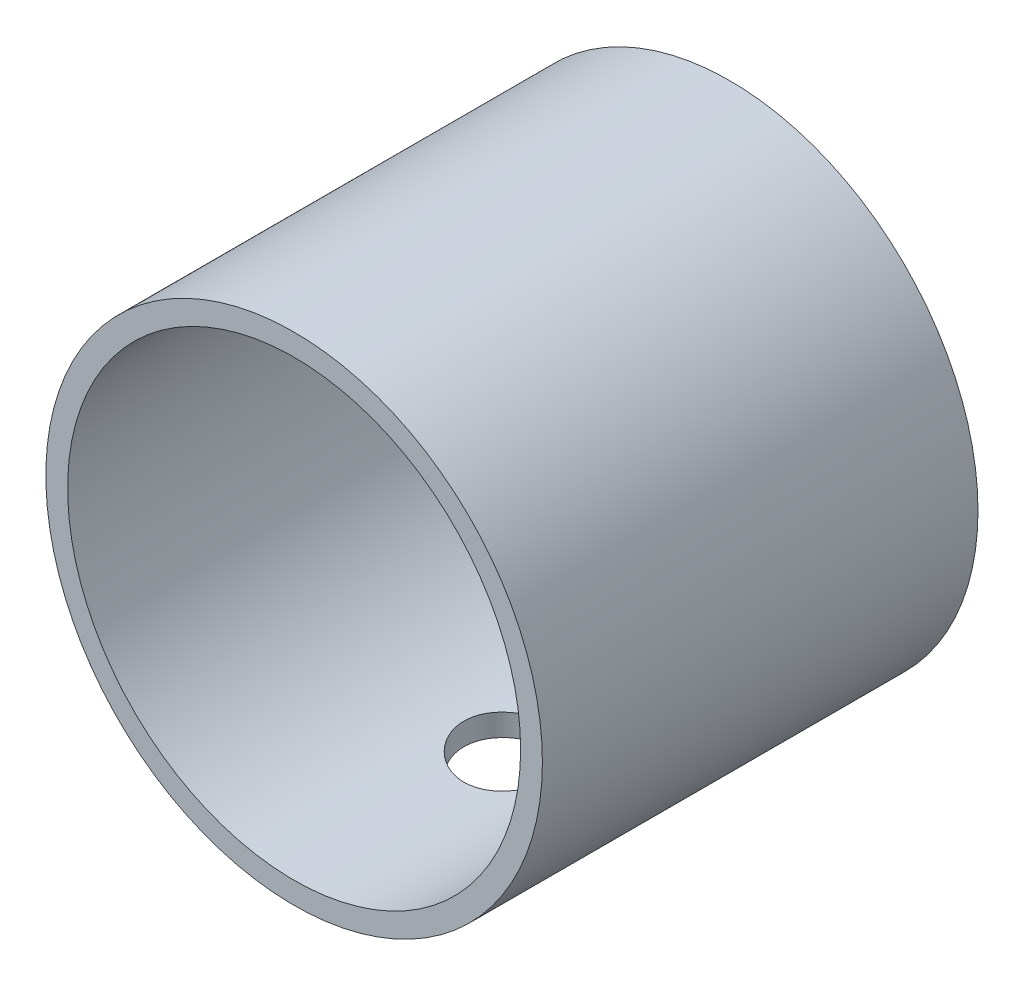
ISO-10303-21;
HEADER;
FILE_DESCRIPTION(('STEP AP214'),'2;1');
FILE_NAME('part.step','',(''),(''),'','','');
FILE_SCHEMA(('AUTOMOTIVE_DESIGN { 1 0 10303 214 1 1 1 1 }'));
ENDSEC;
DATA;
#1=APPLICATION_CONTEXT('core data for automotive mechanical design processes');
#2=APPLICATION_PROTOCOL_DEFINITION('international standard','automotive_design',2000,#1);
#3=PRODUCT_CONTEXT('',#1,'mechanical');
#4=PRODUCT('Part','Part','',(#3));
#5=PRODUCT_RELATED_PRODUCT_CATEGORY('part','',(#4));
#6=PRODUCT_DEFINITION_FORMATION('','',#4);
#7=PRODUCT_DEFINITION_CONTEXT('part definition',#1,'design');
#8=PRODUCT_DEFINITION('design','',#6,#7);
#9=PRODUCT_DEFINITION_SHAPE('','',#8);
#10=(LENGTH_UNIT() NAMED_UNIT(*) SI_UNIT(.MILLI.,.METRE.));
#11=(NAMED_UNIT(*) PLANE_ANGLE_UNIT() SI_UNIT($,.RADIAN.));
#12=(NAMED_UNIT(*) SI_UNIT($,.STERADIAN.) SOLID_ANGLE_UNIT());
#13=UNCERTAINTY_MEASURE_WITH_UNIT(LENGTH_MEASURE(1.E-05),#10,'distance_accuracy_value','');
#14=(GEOMETRIC_REPRESENTATION_CONTEXT(3) GLOBAL_UNCERTAINTY_ASSIGNED_CONTEXT((#13)) GLOBAL_UNIT_ASSIGNED_CONTEXT((#10,
#11,#12)) REPRESENTATION_CONTEXT('',''));
#15=CARTESIAN_POINT('',(0.,0.,0.));
#16=DIRECTION('',(0.,0.,1.));
#17=DIRECTION('',(1.,0.,0.));
#18=AXIS2_PLACEMENT_3D('',#15,#16,#17);
#19=CARTESIAN_POINT('',(0.,0.,50.));
#20=DIRECTION('',(0.,0.,1.));
#21=DIRECTION('',(1.,0.,0.));
#22=AXIS2_PLACEMENT_3D('',#19,#20,#21);
#23=PLANE('',#22);
#24=CARTESIAN_POINT('',(0.,0.,50.));
#25=DIRECTION('',(0.,0.,1.));
#26=DIRECTION('',(1.,0.,0.));
#27=AXIS2_PLACEMENT_3D('',#24,#25,#26);
#28=CIRCLE('',#27,28.5);
#29=CARTESIAN_POINT('',(28.5,0.,50.));
#30=VERTEX_POINT('',#29);
#31=EDGE_CURVE('E10',#30,#30,#28,.T.);
#32=ORIENTED_EDGE('',*,*,#31,.T.);
#33=EDGE_LOOP('',(#32));
#34=FACE_BOUND('',#33,.T.);
#35=CARTESIAN_POINT('',(0.,0.,50.));
#36=DIRECTION('',(0.,0.,1.));
#37=DIRECTION('',(1.,0.,0.));
#38=AXIS2_PLACEMENT_3D('',#35,#36,#37);
#39=CIRCLE('',#38,26.);
#40=CARTESIAN_POINT('',(26.,0.,50.));
#41=VERTEX_POINT('',#40);
#42=EDGE_CURVE('E50',#41,#41,#39,.T.);
#43=ORIENTED_EDGE('',*,*,#42,.F.);
#44=EDGE_LOOP('',(#43));
#45=FACE_BOUND('',#44,.T.);
#46=ADVANCED_FACE('F31',(#34,#45),#23,.T.);
#47=CARTESIAN_POINT('',(0.,0.,0.));
#48=DIRECTION('',(0.,0.,1.));
#49=DIRECTION('',(1.,0.,0.));
#50=AXIS2_PLACEMENT_3D('',#47,#48,#49);
#51=PLANE('',#50);
#52=CARTESIAN_POINT('',(0.,0.,0.));
#53=DIRECTION('',(0.,0.,1.));
#54=DIRECTION('',(1.,0.,0.));
#55=AXIS2_PLACEMENT_3D('',#52,#53,#54);
#56=CIRCLE('',#55,28.5);
#57=CARTESIAN_POINT('',(28.5,0.,0.));
#58=VERTEX_POINT('',#57);
#59=EDGE_CURVE('E45',#58,#58,#56,.T.);
#60=ORIENTED_EDGE('',*,*,#59,.F.);
#61=EDGE_LOOP('',(#60));
#62=FACE_BOUND('',#61,.T.);
#63=CARTESIAN_POINT('',(0.,0.,0.));
#64=DIRECTION('',(0.,0.,1.));
#65=DIRECTION('',(1.,0.,0.));
#66=AXIS2_PLACEMENT_3D('',#63,#64,#65);
#67=CIRCLE('',#66,26.);
#68=CARTESIAN_POINT('',(26.,0.,0.));
#69=VERTEX_POINT('',#68);
#70=EDGE_CURVE('E52',#69,#69,#67,.T.);
#71=ORIENTED_EDGE('',*,*,#70,.T.);
#72=EDGE_LOOP('',(#71));
#73=FACE_BOUND('',#72,.T.);
#74=ADVANCED_FACE('F73',(#62,#73),#51,.F.);
#75=CARTESIAN_POINT('',(0.,0.,50.));
#76=DIRECTION('',(0.,0.,-1.));
#77=DIRECTION('',(-1.,0.,0.));
#78=AXIS2_PLACEMENT_3D('',#75,#76,#77);
#79=CYLINDRICAL_SURFACE('',#78,28.5);
#80=CARTESIAN_POINT('',(0.,-28.5,30.5));
#81=CARTESIAN_POINT('',(0.152999027665979,-28.5000014221919,30.5000028847846));
#82=CARTESIAN_POINT('',(0.305961296387603,-28.4987657957853,30.493614084732));
#83=CARTESIAN_POINT('',(0.610828563499401,-28.493860888237,30.4681146269617));
#84=CARTESIAN_POINT('',(0.762733371734682,-28.4901911802619,30.4490017379837));
#85=CARTESIAN_POINT('',(1.06442565876899,-28.4805161167106,30.3981863718479));
#86=CARTESIAN_POINT('',(1.21421194327397,-28.4745094941689,30.3664770653072));
#87=CARTESIAN_POINT('',(1.51058015613231,-28.4603261340961,30.2907039886646));
#88=CARTESIAN_POINT('',(1.65716088582895,-28.452148599319,30.2466356795059));
#89=CARTESIAN_POINT('',(1.94584324614096,-28.4338634005775,30.1465525350187));
#90=CARTESIAN_POINT('',(2.08795049465545,-28.4237582799862,30.0905534306451));
#91=CARTESIAN_POINT('',(2.36696279019953,-28.4018851183006,29.9669685120469));
#92=CARTESIAN_POINT('',(2.50386589634727,-28.3901164643656,29.8993784257743));
#93=CARTESIAN_POINT('',(2.77142756371521,-28.3652469730652,29.7531486482534));
#94=CARTESIAN_POINT('',(2.90208895397276,-28.3521467478153,29.6745140278222));
#95=CARTESIAN_POINT('',(3.15641107608027,-28.3249613064169,29.5066938115335));
#96=CARTESIAN_POINT('',(3.28006917126932,-28.3108757236952,29.4175042804058));
#97=CARTESIAN_POINT('',(3.52082947379447,-28.2819487280563,29.2281755890311));
#98=CARTESIAN_POINT('',(3.63784488668872,-28.2671007189836,29.1279270491332));
#99=CARTESIAN_POINT('',(3.86308423206199,-28.2372005541132,28.9179453310994));
#100=CARTESIAN_POINT('',(3.97130489133659,-28.2221483247194,28.808208652774));
#101=CARTESIAN_POINT('',(4.17814238627465,-28.1922692396082,28.5800596877543));
#102=CARTESIAN_POINT('',(4.27676201793469,-28.1774423193444,28.4616499445253));
#103=CARTESIAN_POINT('',(4.46378927759803,-28.1484199737008,28.2168800624227));
#104=CARTESIAN_POINT('',(4.55219312578599,-28.1342247832462,28.0905170073842));
#105=CARTESIAN_POINT('',(4.71879594626622,-28.1067634917844,27.8296825789066));
#106=CARTESIAN_POINT('',(4.79690675262082,-28.0935058184955,27.6951539718719));
#107=CARTESIAN_POINT('',(4.94152996771415,-28.0684283562414,27.4198093956019));
#108=CARTESIAN_POINT('',(5.00803802940667,-28.0566091066908,27.2789910946024));
#109=CARTESIAN_POINT('',(5.12889067582267,-28.0347688096959,26.9921535345047));
#110=CARTESIAN_POINT('',(5.1832406316303,-28.0247469686002,26.8461366051816));
#111=CARTESIAN_POINT('',(5.27940674214967,-28.0067888831923,26.5498919523921));
#112=CARTESIAN_POINT('',(5.32121834306304,-27.9988533967508,26.3996627206708));
#113=CARTESIAN_POINT('',(5.42637760720503,-27.9787375043035,25.948104732841));
#114=CARTESIAN_POINT('',(5.47107435145204,-27.9699435242939,25.6420326897452));
#115=CARTESIAN_POINT('',(5.50857417921851,-27.9625811652701,25.02678575995));
#116=CARTESIAN_POINT('',(5.50138219654965,-27.9640118140526,24.7176111710463));
#117=CARTESIAN_POINT('',(5.43588802950817,-27.9768151477162,24.1092989841534));
#118=CARTESIAN_POINT('',(5.37830230452636,-27.9880484596045,23.8100814798011));
#119=CARTESIAN_POINT('',(5.21476609769148,-28.018977010303,23.2256476437351));
#120=CARTESIAN_POINT('',(5.10881345050769,-28.0386726279584,22.9404319394988));
#121=CARTESIAN_POINT('',(4.85086223336583,-28.0844497001242,22.3900002043527));
#122=CARTESIAN_POINT('',(4.69857658625098,-28.1105707674668,22.124922121425));
#123=CARTESIAN_POINT('',(4.35248370318823,-28.1662300270738,21.623813395137));
#124=CARTESIAN_POINT('',(4.15867201215163,-28.1957685858245,21.3877858727241));
#125=CARTESIAN_POINT('',(3.73117659713676,-28.2555405057521,20.9473387598728));
#126=CARTESIAN_POINT('',(3.49688044974372,-28.2857772267584,20.7435135721283));
#127=CARTESIAN_POINT('',(2.99711002060326,-28.3430854476543,20.3779680959047));
#128=CARTESIAN_POINT('',(2.7316353900868,-28.3701569121298,20.2162482784902));
#129=CARTESIAN_POINT('',(2.17640650305288,-28.4181440367153,19.9394069024372));
#130=CARTESIAN_POINT('',(1.88661932252079,-28.4390511704482,19.8243498049431));
#131=CARTESIAN_POINT('',(1.29133665829096,-28.4722886118963,19.6447150138991));
#132=CARTESIAN_POINT('',(0.985842948127889,-28.484619885698,19.5801316342907));
#133=CARTESIAN_POINT('',(0.372930397877595,-28.4991827109023,19.5041110223372));
#134=CARTESIAN_POINT('',(0.0656160786975817,-28.5015689390444,19.4918597849589));
#135=CARTESIAN_POINT('',(-0.546669211732907,-28.4964010939677,19.5186639816571));
#136=CARTESIAN_POINT('',(-0.851640304409078,-28.4888475393695,19.5577167388836));
#137=CARTESIAN_POINT('',(-1.44798119759097,-28.4647453761076,19.6853437735188));
#138=CARTESIAN_POINT('',(-1.73944299168122,-28.4482720667841,19.7735036717203));
#139=CARTESIAN_POINT('',(-2.30344828684298,-28.4081702255106,19.9963922177382));
#140=CARTESIAN_POINT('',(-2.5759904433322,-28.3845411856553,20.1311241712807));
#141=CARTESIAN_POINT('',(-3.09787633753002,-28.3323632313317,20.4451160723121));
#142=CARTESIAN_POINT('',(-3.34691726316845,-28.3037608652429,20.624870254526));
#143=CARTESIAN_POINT('',(-3.81159218432684,-28.2449415295857,21.0231394142316));
#144=CARTESIAN_POINT('',(-4.02722285798005,-28.2147243998681,21.2416582413318));
#145=CARTESIAN_POINT('',(-4.4220707238848,-28.155564303968,21.7149436852578));
#146=CARTESIAN_POINT('',(-4.60073096046742,-28.1266453437901,21.9701784165775));
#147=CARTESIAN_POINT('',(-4.91264185678548,-28.0738505412016,22.5075269840082));
#148=CARTESIAN_POINT('',(-5.04589426317057,-28.0499745048243,22.7896397856978));
#149=CARTESIAN_POINT('',(-5.26243466695746,-28.0101570893528,23.3713034805248));
#150=CARTESIAN_POINT('',(-5.345971748418,-27.9941762234929,23.6707590490898));
#151=CARTESIAN_POINT('',(-5.4614553141596,-27.9718806346853,24.2799678289475));
#152=CARTESIAN_POINT('',(-5.49340800668772,-27.9655647485497,24.5897197964752));
#153=CARTESIAN_POINT('',(-5.5018774906115,-27.9638909980807,25.052147508132));
#154=CARTESIAN_POINT('',(-5.49830742485885,-27.9645968468692,25.2046989838849));
#155=CARTESIAN_POINT('',(-5.47851955607518,-27.9684816434454,25.5089321983806));
#156=CARTESIAN_POINT('',(-5.4623065415704,-27.9716596548985,25.6606142445145));
#157=CARTESIAN_POINT('',(-5.41734680639159,-27.9804014621201,25.9620819811988));
#158=CARTESIAN_POINT('',(-5.38859567870312,-27.9859660967501,26.1118669858926));
#159=CARTESIAN_POINT('',(-5.31879946697563,-27.9993149081431,26.408388794817));
#160=CARTESIAN_POINT('',(-5.27775877722443,-28.0070982915168,26.5551266685668));
#161=CARTESIAN_POINT('',(-5.18377561494467,-28.0246453738365,26.8443289094589));
#162=CARTESIAN_POINT('',(-5.13085423817984,-28.0344055597342,26.986800350142));
#163=CARTESIAN_POINT('',(-5.01348260198808,-28.0556330396245,27.2667193778126));
#164=CARTESIAN_POINT('',(-4.94903643262596,-28.0670997277505,27.4041687263302));
#165=CARTESIAN_POINT('',(-4.80903742968029,-28.0914258459167,27.673231642169));
#166=CARTESIAN_POINT('',(-4.73348004188552,-28.1042858464693,27.8048427876269));
#167=CARTESIAN_POINT('',(-4.57183531516177,-28.1310331809019,28.0612552432783));
#168=CARTESIAN_POINT('',(-4.48575160972347,-28.1449201596376,28.1860588819071));
#169=CARTESIAN_POINT('',(-4.30214085577146,-28.1735754536874,28.4300541786235));
#170=CARTESIAN_POINT('',(-4.20445087509209,-28.1883544092221,28.5491220108751));
#171=CARTESIAN_POINT('',(-3.99948857440641,-28.2181645182373,28.7785909687343));
#172=CARTESIAN_POINT('',(-3.89221964550034,-28.2331955809493,28.8889951356168));
#173=CARTESIAN_POINT('',(-3.66872983020097,-28.2631055637154,29.1005006578453));
#174=CARTESIAN_POINT('',(-3.55250367444284,-28.2779843882907,29.2015964593239));
#175=CARTESIAN_POINT('',(-3.31198337485695,-28.307162227715,29.393682335048));
#176=CARTESIAN_POINT('',(-3.18769221838913,-28.3214614541004,29.4846761177098));
#177=CARTESIAN_POINT('',(-2.93055657030203,-28.3492279129138,29.6568245312855));
#178=CARTESIAN_POINT('',(-2.79763881518953,-28.3626853661096,29.7378713650553));
#179=CARTESIAN_POINT('',(-2.52536171512821,-28.3882235724951,29.8884293447911));
#180=CARTESIAN_POINT('',(-2.38600476702075,-28.4003048322301,29.9579447395429));
#181=CARTESIAN_POINT('',(-2.10186526354853,-28.4227452683883,30.0849145448348));
#182=CARTESIAN_POINT('',(-1.95708616718364,-28.4331055205271,30.1423764953268));
#183=CARTESIAN_POINT('',(-1.66310751202432,-28.4518151326428,30.2448366882404));
#184=CARTESIAN_POINT('',(-1.51390883335696,-28.4601648900113,30.2898373939997));
#185=CARTESIAN_POINT('',(-1.14079027434396,-28.4780260954567,30.3852717292222));
#186=CARTESIAN_POINT('',(-0.914852425300794,-28.4862245147996,30.4282378976399));
#187=CARTESIAN_POINT('',(-0.459248724737565,-28.4972103240361,30.4855994673627));
#188=CARTESIAN_POINT('',(-0.22958297812117,-28.4999978659273,30.499995671231));
#189=CARTESIAN_POINT('',(0.,-28.5,30.5));
#190=B_SPLINE_CURVE_WITH_KNOTS('',3,(#80,#81,#82,#83,#84,#85,#86,#87,#88,#89,#90,#91,#92,#93,
#94,#95,#96,#97,#98,#99,#100,#101,#102,#103,#104,#105,#106,#107,#108,#109,#110,#111,#112,#113,
#114,#115,#116,#117,#118,#119,#120,#121,#122,#123,#124,#125,#126,#127,#128,#129,#130,#131,#132,
#133,#134,#135,#136,#137,#138,#139,#140,#141,#142,#143,#144,#145,#146,#147,#148,#149,#150,#151,
#152,#153,#154,#155,#156,#157,#158,#159,#160,#161,#162,#163,#164,#165,#166,#167,#168,#169,#170,
#171,#172,#173,#174,#175,#176,#177,#178,#179,#180,#181,#182,#183,#184,#185,#186,#187,#188,#189),
.UNSPECIFIED.,.T.,.F.,(4,2,2,2,2,2,2,2,2,2,2,2,2,2,2,2,2,2,2,2,2,2,2,2,2,2,2,2,2,2,2,2,2,2,2,2,
2,2,2,2,2,2,2,2,2,2,2,2,2,2,2,2,2,2,4),(0.,0.458795571821759,0.917671617943335,1.37679679257931,
1.83609081017308,2.29478294774098,2.75364450865476,3.21229607946212,3.6711191948915,
4.13497536355983,4.59900338562003,5.06289586736369,5.52695944234277,5.99477021646012,
6.46275588437195,6.93053440026092,7.39848260318771,8.32191059028985,9.24525077489621,
10.1556730694625,11.0661361265715,11.9823593980407,12.8986810150603,13.8303220122583,
14.7619734319808,15.694907511931,16.6277364781126,17.5460015969987,18.4642188061581,
19.3748027286701,20.2854512985201,21.2065719113845,22.1277840494234,23.0619994996104,
23.996179010372,24.9256378006248,25.854984720984,26.3123227210671,26.7694875881249,
27.2268132734863,27.683975631147,28.1403325671859,28.5965278657338,29.0529106712194,
29.5091363841393,29.9727604309253,30.4362209932125,30.899956312778,31.3635208298414,
31.83173316606,32.2997726033063,32.7675183826897,33.2351716320205,33.9236375284847,
34.6120840848746),.UNSPECIFIED.);
#191=CARTESIAN_POINT('',(0.,-28.5,30.5));
#192=VERTEX_POINT('',#191);
#193=EDGE_CURVE('E55',#192,#192,#190,.T.);
#194=ORIENTED_EDGE('',*,*,#193,.T.);
#195=EDGE_LOOP('',(#194));
#196=FACE_BOUND('',#195,.T.);
#197=ORIENTED_EDGE('',*,*,#31,.F.);
#198=EDGE_LOOP('',(#197));
#199=FACE_BOUND('',#198,.T.);
#200=ORIENTED_EDGE('',*,*,#59,.T.);
#201=EDGE_LOOP('',(#200));
#202=FACE_BOUND('',#201,.T.);
#203=ADVANCED_FACE('F33',(#196,#199,#202),#79,.T.);
#204=CARTESIAN_POINT('',(0.,0.,50.));
#205=DIRECTION('',(0.,0.,-1.));
#206=DIRECTION('',(-1.,0.,0.));
#207=AXIS2_PLACEMENT_3D('',#204,#205,#206);
#208=CYLINDRICAL_SURFACE('',#207,26.);
#209=CARTESIAN_POINT('',(0.,-26.,30.5));
#210=CARTESIAN_POINT('',(0.152696710266405,-26.0000017732406,30.500003334937));
#211=CARTESIAN_POINT('',(0.305352858365942,-25.9986525684042,30.4936395113002));
#212=CARTESIAN_POINT('',(0.609605841063573,-25.9932972947195,30.468242196421));
#213=CARTESIAN_POINT('',(0.761202505206505,-25.9892908078648,30.449206711849));
#214=CARTESIAN_POINT('',(1.06226606972406,-25.978727842005,30.3986023926368));
#215=CARTESIAN_POINT('',(1.2117319285527,-25.9721701574687,30.3670276325979));
#216=CARTESIAN_POINT('',(1.50746102526121,-25.9566849202455,30.2915834252245));
#217=CARTESIAN_POINT('',(1.65372306396901,-25.9477564960738,30.2477094563641));
#218=CARTESIAN_POINT('',(1.94176298250361,-25.9277915021968,30.1480820061399));
#219=CARTESIAN_POINT('',(2.08354684259946,-25.9167578956999,30.0923452100422));
#220=CARTESIAN_POINT('',(2.36192878050332,-25.8928719667996,29.9693517883639));
#221=CARTESIAN_POINT('',(2.49852492276609,-25.8800189738732,29.9020909137273));
#222=CARTESIAN_POINT('',(2.76550452936401,-25.8528525289883,29.756583629454));
#223=CARTESIAN_POINT('',(2.89589062925206,-25.8385397048347,29.6783419367536));
#224=CARTESIAN_POINT('',(3.14970247504028,-25.8088300638434,29.5113699205899));
#225=CARTESIAN_POINT('',(3.27312559302713,-25.7934328426056,29.4226356757129));
#226=CARTESIAN_POINT('',(3.51372670509881,-25.7617670741337,29.2340750075208));
#227=CARTESIAN_POINT('',(3.63080137125803,-25.7454897382787,29.1341181936775));
#228=CARTESIAN_POINT('',(3.85618848318602,-25.7126970051813,28.924726818048));
#229=CARTESIAN_POINT('',(3.96449766493982,-25.6961815219321,28.8152887568392));
#230=CARTESIAN_POINT('',(4.17154955603227,-25.6633817127818,28.5877333031174));
#231=CARTESIAN_POINT('',(4.270294951355,-25.6470973230812,28.469618363984));
#232=CARTESIAN_POINT('',(4.45761415263849,-25.6152046412009,28.2254247782207));
#233=CARTESIAN_POINT('',(4.54618419313998,-25.599596600631,28.0993432100668));
#234=CARTESIAN_POINT('',(4.71331706101922,-25.5693552872972,27.8388079180519));
#235=CARTESIAN_POINT('',(4.7917717463403,-25.5547332370458,27.7042834724986));
#236=CARTESIAN_POINT('',(4.93707869831844,-25.527058714969,27.4288899155799));
#237=CARTESIAN_POINT('',(5.00392660482063,-25.5140068335498,27.288018444838));
#238=CARTESIAN_POINT('',(5.12544528166287,-25.4898736592522,27.0010170183099));
#239=CARTESIAN_POINT('',(5.18012162020181,-25.4787914657587,26.8548895027243));
#240=CARTESIAN_POINT('',(5.27691827138478,-25.4589186975852,26.5583665289638));
#241=CARTESIAN_POINT('',(5.31903404072909,-25.4501289522533,26.4079695479654));
#242=CARTESIAN_POINT('',(5.42488099516896,-25.427860472795,25.9565535892917));
#243=CARTESIAN_POINT('',(5.47003508995308,-25.4180866792856,25.6507456695171));
#244=CARTESIAN_POINT('',(5.50851174579967,-25.4097748671277,25.0359197123241));
#245=CARTESIAN_POINT('',(5.50184025288988,-25.4112355595296,24.7269020472273));
#246=CARTESIAN_POINT('',(5.43753143134929,-25.425071827777,24.1197654831049));
#247=CARTESIAN_POINT('',(5.38076099264253,-25.4372617406008,23.8215506225759));
#248=CARTESIAN_POINT('',(5.21921846090793,-25.4708951279244,23.2389875919585));
#249=CARTESIAN_POINT('',(5.1144438316849,-25.4923390913381,22.9546401554031));
#250=CARTESIAN_POINT('',(4.85906337702358,-25.5422487251904,22.4054073541849));
#251=CARTESIAN_POINT('',(4.70812009675813,-25.5707657938402,22.1406837429281));
#252=CARTESIAN_POINT('',(4.36492333573268,-25.6315767589559,21.6400009507845));
#253=CARTESIAN_POINT('',(4.17266457005307,-25.6638711383599,21.4040454558635));
#254=CARTESIAN_POINT('',(3.74768376037394,-25.729397842583,20.9625988445773));
#255=CARTESIAN_POINT('',(3.51422325901309,-25.7626359415598,20.757818835595));
#256=CARTESIAN_POINT('',(3.01590351317701,-25.8257100714785,20.3902071281144));
#257=CARTESIAN_POINT('',(2.75104376907516,-25.8555460482709,20.2273760972416));
#258=CARTESIAN_POINT('',(2.19660678414072,-25.9085414440315,19.9481262422664));
#259=CARTESIAN_POINT('',(1.90698367822908,-25.9316881104978,19.831795907502));
#260=CARTESIAN_POINT('',(1.31170388765016,-25.9686013915664,19.6496466647123));
#261=CARTESIAN_POINT('',(1.00604938666216,-25.9823692801221,19.5838208963161));
#262=CARTESIAN_POINT('',(0.393487281616225,-25.9987939455803,19.5055727727673));
#263=CARTESIAN_POINT('',(0.0867091127320476,-26.0016529475372,19.4921783415133));
#264=CARTESIAN_POINT('',(-0.524701312239867,-25.9965024316175,19.5165449885749));
#265=CARTESIAN_POINT('',(-0.829333702777753,-25.9884936008974,19.5543028326095));
#266=CARTESIAN_POINT('',(-1.42461776962068,-25.9626344959745,19.679095474202));
#267=CARTESIAN_POINT('',(-1.71538019139245,-25.9448852268135,19.7656247735983));
#268=CARTESIAN_POINT('',(-2.27826612153071,-25.9015301666823,19.9849465042456));
#269=CARTESIAN_POINT('',(-2.5503881123878,-25.8759237369918,20.117742696721));
#270=CARTESIAN_POINT('',(-3.0723198456199,-25.8191937279616,20.4278841426261));
#271=CARTESIAN_POINT('',(-3.32177918193363,-25.7880003995425,20.6058060488581));
#272=CARTESIAN_POINT('',(-3.78764933922966,-25.723707261441,21.0003851549466));
#273=CARTESIAN_POINT('',(-4.00405615855405,-25.6906072215808,21.217047038158));
#274=CARTESIAN_POINT('',(-4.40148601389684,-25.6255391239078,21.6873988677236));
#275=CARTESIAN_POINT('',(-4.58183813404755,-25.5936002380365,21.9416604201667));
#276=CARTESIAN_POINT('',(-4.89727937104976,-25.5351229163127,22.4774497468613));
#277=CARTESIAN_POINT('',(-5.0323703974928,-25.5085842526402,22.7589763701374));
#278=CARTESIAN_POINT('',(-5.25257850755859,-25.4641518490825,23.3397637756661));
#279=CARTESIAN_POINT('',(-5.33796906184382,-25.4462108997104,23.6389173426543));
#280=CARTESIAN_POINT('',(-5.45714877663195,-25.4209241759895,24.2479260359901));
#281=CARTESIAN_POINT('',(-5.4909455801155,-25.4135768323371,24.5577795703131));
#282=CARTESIAN_POINT('',(-5.50207726036747,-25.4111590979774,25.020053281102));
#283=CARTESIAN_POINT('',(-5.49940940735532,-25.4117401939873,25.1722275005447));
#284=CARTESIAN_POINT('',(-5.48148686589421,-25.4156138293037,25.4757825845919));
#285=CARTESIAN_POINT('',(-5.46623697436317,-25.4189053352619,25.6271637294256));
#286=CARTESIAN_POINT('',(-5.42325977145089,-25.4281089390728,25.9281049404537));
#287=CARTESIAN_POINT('',(-5.39552812977035,-25.4340219463934,26.0776643561243));
#288=CARTESIAN_POINT('',(-5.32782306458597,-25.4482906893854,26.3738125799993));
#289=CARTESIAN_POINT('',(-5.28785399520677,-25.4566455561857,26.5204024250416));
#290=CARTESIAN_POINT('',(-5.19610514737913,-25.4755309212674,26.8092523400913));
#291=CARTESIAN_POINT('',(-5.14435764555786,-25.4860554666475,26.9515230601835));
#292=CARTESIAN_POINT('',(-5.02940027750039,-25.5089898782409,27.2311375435225));
#293=CARTESIAN_POINT('',(-4.96619444860524,-25.5213990801464,27.3684830218253));
#294=CARTESIAN_POINT('',(-4.82873591384333,-25.5477632323224,27.6374473811426));
#295=CARTESIAN_POINT('',(-4.75447853410013,-25.5617188359497,27.7690638086636));
#296=CARTESIAN_POINT('',(-4.5954832797184,-25.5907807518929,28.0256073711579));
#297=CARTESIAN_POINT('',(-4.51074896796755,-25.6058866723532,28.1505367595948));
#298=CARTESIAN_POINT('',(-4.32961736185796,-25.6371414010465,28.3952963898356));
#299=CARTESIAN_POINT('',(-4.23302635002306,-25.6533047203179,28.5149814648211));
#300=CARTESIAN_POINT('',(-4.03022535745781,-25.6859460652507,28.745780975946));
#301=CARTESIAN_POINT('',(-3.92401874481836,-25.7024239791344,28.8568983880523));
#302=CARTESIAN_POINT('',(-3.70260429627343,-25.7352530775833,29.0699308012779));
#303=CARTESIAN_POINT('',(-3.58739117670854,-25.7516041814792,29.1718403238754));
#304=CARTESIAN_POINT('',(-3.34883055686276,-25.7837121372106,29.3656550972449));
#305=CARTESIAN_POINT('',(-3.22548606032741,-25.7994692051404,29.4575640093739));
#306=CARTESIAN_POINT('',(-2.96987197557149,-25.830149631287,29.6318552452605));
#307=CARTESIAN_POINT('',(-2.83751084929416,-25.8450602636535,29.7141056444953));
#308=CARTESIAN_POINT('',(-2.5662179291805,-25.8734056386916,29.8671111514398));
#309=CARTESIAN_POINT('',(-2.42728858042962,-25.8868409244826,29.9378704939768));
#310=CARTESIAN_POINT('',(-2.14385926300467,-25.9118521819642,30.0673585093705));
#311=CARTESIAN_POINT('',(-1.99936252045853,-25.923429210945,30.1260940286843));
#312=CARTESIAN_POINT('',(-1.70580907228086,-25.9443999653389,30.2311113600207));
#313=CARTESIAN_POINT('',(-1.55675321132545,-25.9537940924425,30.2773954635602));
#314=CARTESIAN_POINT('',(-1.17708147521322,-25.9743500734289,30.3777729549006));
#315=CARTESIAN_POINT('',(-0.944122542523652,-25.9839168143207,30.4235421836533));
#316=CARTESIAN_POINT('',(-0.474076396856678,-25.9967402782096,30.4846525234859));
#317=CARTESIAN_POINT('',(-0.236989345631298,-25.9999972478836,30.4999948240893));
#318=CARTESIAN_POINT('',(0.,-26.,30.5));
#319=B_SPLINE_CURVE_WITH_KNOTS('',3,(#209,#210,#211,#212,#213,#214,#215,#216,#217,#218,#219,
#220,#221,#222,#223,#224,#225,#226,#227,#228,#229,#230,#231,#232,#233,#234,#235,#236,#237,#238,
#239,#240,#241,#242,#243,#244,#245,#246,#247,#248,#249,#250,#251,#252,#253,#254,#255,#256,#257,
#258,#259,#260,#261,#262,#263,#264,#265,#266,#267,#268,#269,#270,#271,#272,#273,#274,#275,#276,
#277,#278,#279,#280,#281,#282,#283,#284,#285,#286,#287,#288,#289,#290,#291,#292,#293,#294,#295,
#296,#297,#298,#299,#300,#301,#302,#303,#304,#305,#306,#307,#308,#309,#310,#311,#312,#313,#314,
#315,#316,#317,#318),.UNSPECIFIED.,.T.,.F.,(4,2,2,2,2,2,2,2,2,2,2,2,2,2,2,2,2,2,2,2,2,2,2,2,2,2,
2,2,2,2,2,2,2,2,2,2,2,2,2,2,2,2,2,2,2,2,2,2,2,2,2,2,2,2,4),(0.,0.457881882816474,
0.915835810273162,1.37400640053574,1.83234564823854,2.29004444470314,2.74791236441124,
3.20558420030161,3.6634276271444,4.12728503257533,4.5913143779765,5.05521302077706,
5.51928278319777,5.98796221725755,6.45681733437122,6.9254575187616,7.39426701058073,
8.31717599583767,9.23997909592056,10.1471208136108,11.0543104636536,11.9682961331644,
12.8823987859091,13.814953687777,14.7475234305066,15.6818594703437,16.6160685706244,
17.53287304153,18.4496195469831,19.3570345651474,20.2645233679964,21.1842509215126,
22.1040897380403,23.039713112898,23.9752970082961,24.9056830779056,25.8359313088642,
26.2920812108326,26.7480572853985,27.2041916740332,27.6601639565006,28.114901461353,
28.5694790497878,29.0242494355014,29.4788655907376,29.942265839726,30.4055043952346,
30.8690167786127,31.3323588888427,31.801433208777,32.2703342653656,32.7389675788542,
33.2075145875388,33.9181872019296,34.6288320324291),.UNSPECIFIED.);
#320=CARTESIAN_POINT('',(0.,-26.,30.5));
#321=VERTEX_POINT('',#320);
#322=EDGE_CURVE('E36',#321,#321,#319,.T.);
#323=ORIENTED_EDGE('',*,*,#322,.F.);
#324=EDGE_LOOP('',(#323));
#325=FACE_BOUND('',#324,.T.);
#326=ORIENTED_EDGE('',*,*,#42,.T.);
#327=EDGE_LOOP('',(#326));
#328=FACE_BOUND('',#327,.T.);
#329=ORIENTED_EDGE('',*,*,#70,.F.);
#330=EDGE_LOOP('',(#329));
#331=FACE_BOUND('',#330,.T.);
#332=ADVANCED_FACE('F65',(#325,#328,#331),#208,.F.);
#333=CARTESIAN_POINT('',(0.,-50.,25.));
#334=DIRECTION('',(0.,1.,0.));
#335=DIRECTION('',(0.,0.,1.));
#336=AXIS2_PLACEMENT_3D('',#333,#334,#335);
#337=CYLINDRICAL_SURFACE('',#336,5.5);
#338=ORIENTED_EDGE('',*,*,#322,.T.);
#339=EDGE_LOOP('',(#338));
#340=FACE_BOUND('',#339,.T.);
#341=ORIENTED_EDGE('',*,*,#193,.F.);
#342=EDGE_LOOP('',(#341));
#343=FACE_BOUND('',#342,.T.);
#344=ADVANCED_FACE('F62',(#340,#343),#337,.F.);
#345=CLOSED_SHELL('',(#46,#74,#203,#332,#344));
#346=MANIFOLD_SOLID_BREP('B2',#345);
#347=ADVANCED_BREP_SHAPE_REPRESENTATION('',(#18,#346),#14);
#348=SHAPE_DEFINITION_REPRESENTATION(#9,#347);
ENDSEC;
END-ISO-10303-21;
